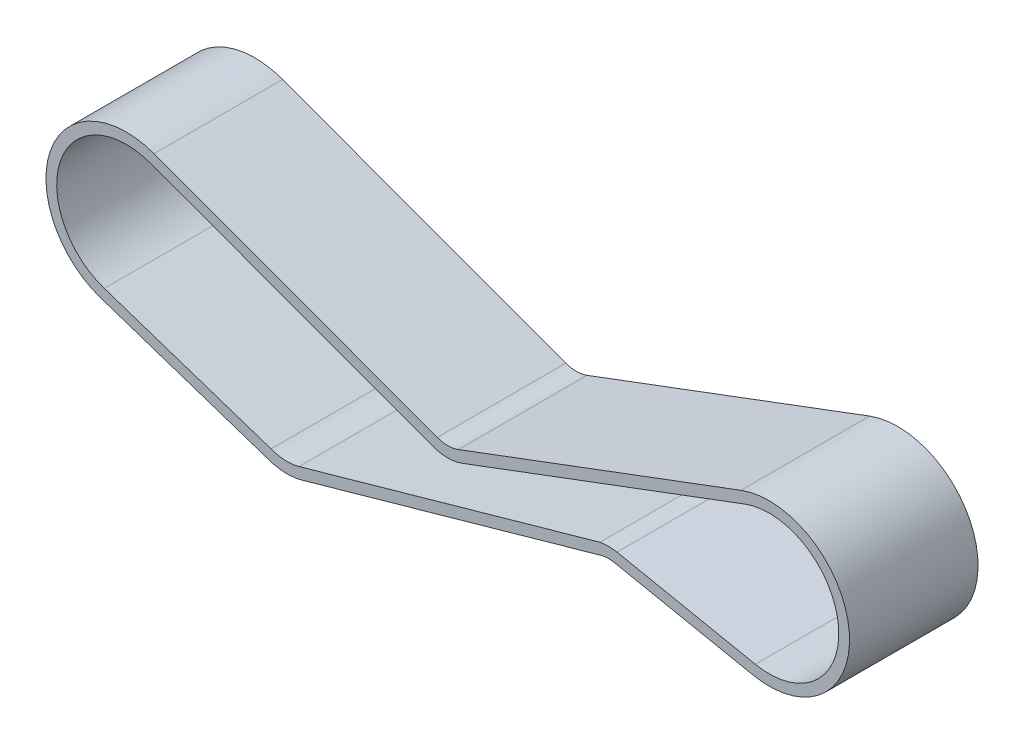
ISO-10303-21;
HEADER;
FILE_DESCRIPTION(('STEP AP214'),'2;1');
FILE_NAME('part.step','',(''),(''),'','','');
FILE_SCHEMA(('AUTOMOTIVE_DESIGN { 1 0 10303 214 1 1 1 1 }'));
ENDSEC;
DATA;
#1=APPLICATION_CONTEXT('core data for automotive mechanical design processes');
#2=APPLICATION_PROTOCOL_DEFINITION('international standard','automotive_design',2000,#1);
#3=PRODUCT_CONTEXT('',#1,'mechanical');
#4=PRODUCT('Part','Part','',(#3));
#5=PRODUCT_RELATED_PRODUCT_CATEGORY('part','',(#4));
#6=PRODUCT_DEFINITION_FORMATION('','',#4);
#7=PRODUCT_DEFINITION_CONTEXT('part definition',#1,'design');
#8=PRODUCT_DEFINITION('design','',#6,#7);
#9=PRODUCT_DEFINITION_SHAPE('','',#8);
#10=(LENGTH_UNIT() NAMED_UNIT(*) SI_UNIT(.MILLI.,.METRE.));
#11=(NAMED_UNIT(*) PLANE_ANGLE_UNIT() SI_UNIT($,.RADIAN.));
#12=(NAMED_UNIT(*) SI_UNIT($,.STERADIAN.) SOLID_ANGLE_UNIT());
#13=UNCERTAINTY_MEASURE_WITH_UNIT(LENGTH_MEASURE(1.E-05),#10,'distance_accuracy_value','');
#14=(GEOMETRIC_REPRESENTATION_CONTEXT(3) GLOBAL_UNCERTAINTY_ASSIGNED_CONTEXT((#13)) GLOBAL_UNIT_ASSIGNED_CONTEXT((#10,
#11,#12)) REPRESENTATION_CONTEXT('',''));
#15=CARTESIAN_POINT('',(0.,0.,0.));
#16=DIRECTION('',(0.,0.,1.));
#17=DIRECTION('',(1.,0.,0.));
#18=AXIS2_PLACEMENT_3D('',#15,#16,#17);
#19=CARTESIAN_POINT('',(29.4770286508606,0.19313179242635,12.));
#20=DIRECTION('',(0.,0.,1.));
#21=DIRECTION('',(1.,0.,0.));
#22=AXIS2_PLACEMENT_3D('',#19,#20,#21);
#23=PLANE('',#22);
#24=CARTESIAN_POINT('',(29.4770286508606,0.19313179242635,12.));
#25=DIRECTION('',(0.,0.,1.));
#26=DIRECTION('',(1.,0.,0.));
#27=AXIS2_PLACEMENT_3D('',#24,#25,#26);
#28=CIRCLE('',#27,7.50000000232554);
#29=CARTESIAN_POINT('',(27.9896361764472,-7.15789967682621,12.));
#30=VERTEX_POINT('',#29);
#31=CARTESIAN_POINT('',(26.8433552594607,7.21550777939224,12.));
#32=VERTEX_POINT('',#31);
#33=EDGE_CURVE('E250',#30,#32,#28,.T.);
#34=ORIENTED_EDGE('',*,*,#33,.T.);
#35=DIRECTION('',(-0.936316797971793,-0.351156452077773,0.));
#36=VECTOR('',#35,1.);
#37=CARTESIAN_POINT('',(0.477214368103966,-2.67285533707343,12.));
#38=LINE('',#37,#36);
#39=CARTESIAN_POINT('',(0.477214368103965,-2.67285533707343,12.));
#40=VERTEX_POINT('',#39);
#41=EDGE_CURVE('E253',#32,#40,#38,.T.);
#42=ORIENTED_EDGE('',*,*,#41,.T.);
#43=CARTESIAN_POINT('',(-0.522638014880138,-0.0068682075736624,12.));
#44=DIRECTION('',(0.,0.,-1.));
#45=DIRECTION('',(1.,0.,0.));
#46=AXIS2_PLACEMENT_3D('',#43,#44,#45);
#47=CIRCLE('',#46,2.84731314793743);
#48=CARTESIAN_POINT('',(-1.50470608838445,-2.67945767500425,12.));
#49=VERTEX_POINT('',#48);
#50=EDGE_CURVE('E256',#40,#49,#47,.T.);
#51=ORIENTED_EDGE('',*,*,#50,.T.);
#52=DIRECTION('',(-0.938635593828724,0.344910455042753,0.));
#53=VECTOR('',#52,1.);
#54=CARTESIAN_POINT('',(-27.9358094284505,7.03289921859945,12.));
#55=LINE('',#54,#53);
#56=CARTESIAN_POINT('',(-27.9358094284505,7.03289921859948,12.));
#57=VERTEX_POINT('',#56);
#58=EDGE_CURVE('E258',#49,#57,#55,.T.);
#59=ORIENTED_EDGE('',*,*,#58,.T.);
#60=CARTESIAN_POINT('',(-30.5226380148801,-0.006868207573652,12.));
#61=DIRECTION('',(0.,0.,1.));
#62=DIRECTION('',(1.,0.,0.));
#63=AXIS2_PLACEMENT_3D('',#60,#61,#62);
#64=CIRCLE('',#63,7.50000050334518);
#65=CARTESIAN_POINT('',(-32.8948896143065,-7.12181233238571,12.));
#66=VERTEX_POINT('',#65);
#67=EDGE_CURVE('E260',#57,#66,#64,.T.);
#68=ORIENTED_EDGE('',*,*,#67,.T.);
#69=DIRECTION('',(0.948659152974535,-0.316300192029089,0.));
#70=VECTOR('',#69,1.);
#71=CARTESIAN_POINT('',(-17.3500032724257,-12.3047597794117,12.));
#72=LINE('',#71,#70);
#73=CARTESIAN_POINT('',(-17.3500032724257,-12.3047597794117,12.));
#74=VERTEX_POINT('',#73);
#75=EDGE_CURVE('E262',#66,#74,#72,.T.);
#76=ORIENTED_EDGE('',*,*,#75,.T.);
#77=CARTESIAN_POINT('',(-15.5226380148801,-7.50686820757365,12.));
#78=DIRECTION('',(0.,0.,1.));
#79=DIRECTION('',(1.,0.,0.));
#80=AXIS2_PLACEMENT_3D('',#77,#78,#79);
#81=CIRCLE('',#80,5.13410433470139);
#82=CARTESIAN_POINT('',(-14.1288162505323,-12.4481522723517,12.));
#83=VERTEX_POINT('',#82);
#84=EDGE_CURVE('E264',#74,#83,#81,.T.);
#85=ORIENTED_EDGE('',*,*,#84,.T.);
#86=DIRECTION('',(0.962443250593871,0.271482944927122,0.));
#87=VECTOR('',#86,1.);
#88=CARTESIAN_POINT('',(13.9124107089229,-4.53837175321432,12.));
#89=LINE('',#88,#87);
#90=CARTESIAN_POINT('',(13.9124107089229,-4.53837175321428,12.));
#91=VERTEX_POINT('',#90);
#92=EDGE_CURVE('E266',#83,#91,#89,.T.);
#93=ORIENTED_EDGE('',*,*,#92,.T.);
#94=CARTESIAN_POINT('',(14.4773619851199,-7.50686820757365,12.));
#95=DIRECTION('',(0.,0.,-1.));
#96=DIRECTION('',(1.,0.,0.));
#97=AXIS2_PLACEMENT_3D('',#94,#95,#96);
#98=CIRCLE('',#97,3.02177781182216);
#99=CARTESIAN_POINT('',(15.0766379284879,-4.54511037011945,12.));
#100=VERTEX_POINT('',#99);
#101=EDGE_CURVE('E268',#91,#100,#98,.T.);
#102=ORIENTED_EDGE('',*,*,#101,.T.);
#103=DIRECTION('',(0.980137528929762,-0.198318996526959,0.));
#104=VECTOR('',#103,1.);
#105=CARTESIAN_POINT('',(15.0766379284879,-4.54511037011945,12.));
#106=LINE('',#105,#104);
#107=EDGE_CURVE('E270',#100,#30,#106,.T.);
#108=ORIENTED_EDGE('',*,*,#107,.T.);
#109=EDGE_LOOP('',(#34,#42,#51,#59,#68,#76,#85,#93,#102,#108));
#110=FACE_BOUND('',#109,.T.);
#111=DIRECTION('',(0.962443250593871,0.271482944927122,0.));
#112=VECTOR('',#111,1.);
#113=CARTESIAN_POINT('',(13.679767044611,-3.5649728413139,12.));
#114=LINE('',#113,#112);
#115=CARTESIAN_POINT('',(-14.4002991954594,-11.4857090217579,12.));
#116=VERTEX_POINT('',#115);
#117=CARTESIAN_POINT('',(13.679767044611,-3.5649728413139,12.));
#118=VERTEX_POINT('',#117);
#119=EDGE_CURVE('E179',#116,#118,#114,.T.);
#120=ORIENTED_EDGE('',*,*,#119,.F.);
#121=CARTESIAN_POINT('',(-15.5226380148801,-7.50686820757365,12.));
#122=DIRECTION('',(0.,0.,1.));
#123=DIRECTION('',(1.,0.,0.));
#124=AXIS2_PLACEMENT_3D('',#121,#122,#123);
#125=CIRCLE('',#124,4.13410433470138);
#126=CARTESIAN_POINT('',(-17.0126603577239,-11.3631166523737,12.));
#127=VERTEX_POINT('',#126);
#128=EDGE_CURVE('E171',#127,#116,#125,.T.);
#129=ORIENTED_EDGE('',*,*,#128,.F.);
#130=DIRECTION('',(0.948659152974534,-0.316300192029091,0.));
#131=VECTOR('',#130,1.);
#132=CARTESIAN_POINT('',(-17.0126603577239,-11.3631166523737,12.));
#133=LINE('',#132,#131);
#134=CARTESIAN_POINT('',(-32.578589422279,-6.17315317941062,12.));
#135=VERTEX_POINT('',#134);
#136=EDGE_CURVE('E208',#135,#127,#133,.T.);
#137=ORIENTED_EDGE('',*,*,#136,.F.);
#138=CARTESIAN_POINT('',(-30.5226380148817,-0.00686820757311238,12.));
#139=DIRECTION('',(0.,0.,1.));
#140=DIRECTION('',(1.,0.,0.));
#141=AXIS2_PLACEMENT_3D('',#138,#139,#140);
#142=CIRCLE('',#141,6.50000050334519);
#143=CARTESIAN_POINT('',(-28.2807198834948,6.09426362477131,12.));
#144=VERTEX_POINT('',#143);
#145=EDGE_CURVE('E206',#144,#135,#142,.T.);
#146=ORIENTED_EDGE('',*,*,#145,.F.);
#147=DIRECTION('',(-0.938635593828724,0.344910455042753,0.));
#148=VECTOR('',#147,1.);
#149=CARTESIAN_POINT('',(-28.2807198834948,6.0942636247713,12.));
#150=LINE('',#149,#148);
#151=CARTESIAN_POINT('',(-1.8496165434272,-3.61809326883297,12.));
#152=VERTEX_POINT('',#151);
#153=EDGE_CURVE('E204',#152,#144,#150,.T.);
#154=ORIENTED_EDGE('',*,*,#153,.F.);
#155=CARTESIAN_POINT('',(-0.522638014880138,-0.0068682075736624,12.));
#156=DIRECTION('',(0.,0.,-1.));
#157=DIRECTION('',(1.,0.,0.));
#158=AXIS2_PLACEMENT_3D('',#155,#156,#157);
#159=CIRCLE('',#158,3.84731314793743);
#160=CARTESIAN_POINT('',(0.828370820181734,-3.60917213504521,12.));
#161=VERTEX_POINT('',#160);
#162=EDGE_CURVE('E202',#161,#152,#159,.T.);
#163=ORIENTED_EDGE('',*,*,#162,.F.);
#164=DIRECTION('',(-0.936316797971793,-0.351156452077772,0.));
#165=VECTOR('',#164,1.);
#166=CARTESIAN_POINT('',(0.828370820181735,-3.60917213504521,12.));
#167=LINE('',#166,#165);
#168=CARTESIAN_POINT('',(27.1945117115384,6.27919098142043,12.));
#169=VERTEX_POINT('',#168);
#170=EDGE_CURVE('E200',#169,#161,#167,.T.);
#171=ORIENTED_EDGE('',*,*,#170,.F.);
#172=CARTESIAN_POINT('',(29.4770286508606,0.193131792426346,12.));
#173=DIRECTION('',(0.,0.,1.));
#174=DIRECTION('',(1.,0.,0.));
#175=AXIS2_PLACEMENT_3D('',#172,#173,#174);
#176=CIRCLE('',#175,6.50000000232553);
#177=CARTESIAN_POINT('',(28.1879551729742,-6.17776214789645,12.));
#178=VERTEX_POINT('',#177);
#179=EDGE_CURVE('E198',#178,#169,#176,.T.);
#180=ORIENTED_EDGE('',*,*,#179,.F.);
#181=DIRECTION('',(0.980137528929762,-0.198318996526959,0.));
#182=VECTOR('',#181,1.);
#183=CARTESIAN_POINT('',(15.2749569250148,-3.56497284118969,12.));
#184=LINE('',#183,#182);
#185=CARTESIAN_POINT('',(15.2749569250148,-3.56497284118969,12.));
#186=VERTEX_POINT('',#185);
#187=EDGE_CURVE('E194',#186,#178,#184,.T.);
#188=ORIENTED_EDGE('',*,*,#187,.F.);
#189=CARTESIAN_POINT('',(14.4773619851199,-7.50686820757365,12.));
#190=DIRECTION('',(0.,0.,-1.));
#191=DIRECTION('',(1.,0.,0.));
#192=AXIS2_PLACEMENT_3D('',#189,#190,#191);
#193=CIRCLE('',#192,4.0217778118222);
#194=EDGE_CURVE('E192',#118,#186,#193,.T.);
#195=ORIENTED_EDGE('',*,*,#194,.F.);
#196=EDGE_LOOP('',(#120,#129,#137,#146,#154,#163,#171,#180,#188,#195));
#197=FACE_BOUND('',#196,.T.);
#198=ADVANCED_FACE('F34',(#110,#197),#23,.T.);
#199=CARTESIAN_POINT('',(29.4770286508606,0.19313179242635,0.));
#200=DIRECTION('',(0.,0.,1.));
#201=DIRECTION('',(1.,0.,0.));
#202=AXIS2_PLACEMENT_3D('',#199,#200,#201);
#203=PLANE('',#202);
#204=CARTESIAN_POINT('',(29.4770286508606,0.19313179242635,0.));
#205=DIRECTION('',(0.,0.,1.));
#206=DIRECTION('',(1.,0.,0.));
#207=AXIS2_PLACEMENT_3D('',#204,#205,#206);
#208=CIRCLE('',#207,7.50000000232554);
#209=CARTESIAN_POINT('',(27.9896361764472,-7.15789967682621,0.));
#210=VERTEX_POINT('',#209);
#211=CARTESIAN_POINT('',(26.8433552594607,7.21550777939224,0.));
#212=VERTEX_POINT('',#211);
#213=EDGE_CURVE('E187',#210,#212,#208,.T.);
#214=ORIENTED_EDGE('',*,*,#213,.F.);
#215=DIRECTION('',(0.980137528929762,-0.198318996526959,0.));
#216=VECTOR('',#215,1.);
#217=CARTESIAN_POINT('',(15.0766379284879,-4.54511037011945,0.));
#218=LINE('',#217,#216);
#219=CARTESIAN_POINT('',(15.0766379284879,-4.54511037011945,0.));
#220=VERTEX_POINT('',#219);
#221=EDGE_CURVE('E254',#220,#210,#218,.T.);
#222=ORIENTED_EDGE('',*,*,#221,.F.);
#223=CARTESIAN_POINT('',(14.4773619851199,-7.50686820757365,0.));
#224=DIRECTION('',(0.,0.,-1.));
#225=DIRECTION('',(1.,0.,0.));
#226=AXIS2_PLACEMENT_3D('',#223,#224,#225);
#227=CIRCLE('',#226,3.02177781182216);
#228=CARTESIAN_POINT('',(13.9124107089229,-4.53837175321428,0.));
#229=VERTEX_POINT('',#228);
#230=EDGE_CURVE('E289',#229,#220,#227,.T.);
#231=ORIENTED_EDGE('',*,*,#230,.F.);
#232=DIRECTION('',(0.962443250593871,0.271482944927122,0.));
#233=VECTOR('',#232,1.);
#234=CARTESIAN_POINT('',(13.9124107089229,-4.53837175321432,0.));
#235=LINE('',#234,#233);
#236=CARTESIAN_POINT('',(-14.1288162505323,-12.4481522723517,0.));
#237=VERTEX_POINT('',#236);
#238=EDGE_CURVE('E287',#237,#229,#235,.T.);
#239=ORIENTED_EDGE('',*,*,#238,.F.);
#240=CARTESIAN_POINT('',(-15.5226380148801,-7.50686820757365,0.));
#241=DIRECTION('',(0.,0.,1.));
#242=DIRECTION('',(1.,0.,0.));
#243=AXIS2_PLACEMENT_3D('',#240,#241,#242);
#244=CIRCLE('',#243,5.13410433470139);
#245=CARTESIAN_POINT('',(-17.3500032724257,-12.3047597794117,0.));
#246=VERTEX_POINT('',#245);
#247=EDGE_CURVE('E285',#246,#237,#244,.T.);
#248=ORIENTED_EDGE('',*,*,#247,.F.);
#249=DIRECTION('',(0.948659152974535,-0.316300192029089,0.));
#250=VECTOR('',#249,1.);
#251=CARTESIAN_POINT('',(-17.3500032724257,-12.3047597794117,0.));
#252=LINE('',#251,#250);
#253=CARTESIAN_POINT('',(-32.8948896143065,-7.12181233238571,0.));
#254=VERTEX_POINT('',#253);
#255=EDGE_CURVE('E283',#254,#246,#252,.T.);
#256=ORIENTED_EDGE('',*,*,#255,.F.);
#257=CARTESIAN_POINT('',(-30.5226380148801,-0.006868207573652,0.));
#258=DIRECTION('',(0.,0.,1.));
#259=DIRECTION('',(1.,0.,0.));
#260=AXIS2_PLACEMENT_3D('',#257,#258,#259);
#261=CIRCLE('',#260,7.50000050334518);
#262=CARTESIAN_POINT('',(-27.9358094284505,7.03289921859948,0.));
#263=VERTEX_POINT('',#262);
#264=EDGE_CURVE('E281',#263,#254,#261,.T.);
#265=ORIENTED_EDGE('',*,*,#264,.F.);
#266=DIRECTION('',(-0.938635593828724,0.344910455042753,0.));
#267=VECTOR('',#266,1.);
#268=CARTESIAN_POINT('',(-27.9358094284505,7.03289921859945,0.));
#269=LINE('',#268,#267);
#270=CARTESIAN_POINT('',(-1.50470608838445,-2.67945767500425,0.));
#271=VERTEX_POINT('',#270);
#272=EDGE_CURVE('E279',#271,#263,#269,.T.);
#273=ORIENTED_EDGE('',*,*,#272,.F.);
#274=CARTESIAN_POINT('',(-0.522638014880138,-0.0068682075736624,0.));
#275=DIRECTION('',(0.,0.,-1.));
#276=DIRECTION('',(1.,0.,0.));
#277=AXIS2_PLACEMENT_3D('',#274,#275,#276);
#278=CIRCLE('',#277,2.84731314793743);
#279=CARTESIAN_POINT('',(0.477214368103965,-2.67285533707343,0.));
#280=VERTEX_POINT('',#279);
#281=EDGE_CURVE('E277',#280,#271,#278,.T.);
#282=ORIENTED_EDGE('',*,*,#281,.F.);
#283=DIRECTION('',(-0.936316797971793,-0.351156452077773,0.));
#284=VECTOR('',#283,1.);
#285=CARTESIAN_POINT('',(0.477214368103966,-2.67285533707343,0.));
#286=LINE('',#285,#284);
#287=EDGE_CURVE('E275',#212,#280,#286,.T.);
#288=ORIENTED_EDGE('',*,*,#287,.F.);
#289=EDGE_LOOP('',(#214,#222,#231,#239,#248,#256,#265,#273,#282,#288));
#290=FACE_BOUND('',#289,.T.);
#291=CARTESIAN_POINT('',(-15.5226380148801,-7.50686820757365,0.));
#292=DIRECTION('',(0.,0.,1.));
#293=DIRECTION('',(1.,0.,0.));
#294=AXIS2_PLACEMENT_3D('',#291,#292,#293);
#295=CIRCLE('',#294,4.13410433470138);
#296=CARTESIAN_POINT('',(-17.0126603577239,-11.3631166523738,0.));
#297=VERTEX_POINT('',#296);
#298=CARTESIAN_POINT('',(-14.4002991954594,-11.4857090217579,0.));
#299=VERTEX_POINT('',#298);
#300=EDGE_CURVE('E57',#297,#299,#295,.T.);
#301=ORIENTED_EDGE('',*,*,#300,.T.);
#302=DIRECTION('',(0.962443250593871,0.271482944927122,0.));
#303=VECTOR('',#302,1.);
#304=CARTESIAN_POINT('',(13.679767044611,-3.5649728413139,0.));
#305=LINE('',#304,#303);
#306=CARTESIAN_POINT('',(13.679767044611,-3.5649728413139,0.));
#307=VERTEX_POINT('',#306);
#308=EDGE_CURVE('E186',#299,#307,#305,.T.);
#309=ORIENTED_EDGE('',*,*,#308,.T.);
#310=CARTESIAN_POINT('',(14.4773619851199,-7.50686820757365,0.));
#311=DIRECTION('',(0.,0.,-1.));
#312=DIRECTION('',(1.,0.,0.));
#313=AXIS2_PLACEMENT_3D('',#310,#311,#312);
#314=CIRCLE('',#313,4.0217778118222);
#315=CARTESIAN_POINT('',(15.2749569250148,-3.56497284118969,0.));
#316=VERTEX_POINT('',#315);
#317=EDGE_CURVE('E212',#307,#316,#314,.T.);
#318=ORIENTED_EDGE('',*,*,#317,.T.);
#319=DIRECTION('',(0.980137528929762,-0.198318996526959,0.));
#320=VECTOR('',#319,1.);
#321=CARTESIAN_POINT('',(15.2749569250148,-3.56497284118969,0.));
#322=LINE('',#321,#320);
#323=CARTESIAN_POINT('',(28.1879551729742,-6.17776214789645,0.));
#324=VERTEX_POINT('',#323);
#325=EDGE_CURVE('E215',#316,#324,#322,.T.);
#326=ORIENTED_EDGE('',*,*,#325,.T.);
#327=CARTESIAN_POINT('',(29.4770286508606,0.193131792426346,0.));
#328=DIRECTION('',(0.,0.,1.));
#329=DIRECTION('',(1.,0.,0.));
#330=AXIS2_PLACEMENT_3D('',#327,#328,#329);
#331=CIRCLE('',#330,6.50000000232553);
#332=CARTESIAN_POINT('',(27.1945117115384,6.27919098142043,0.));
#333=VERTEX_POINT('',#332);
#334=EDGE_CURVE('E218',#324,#333,#331,.T.);
#335=ORIENTED_EDGE('',*,*,#334,.T.);
#336=DIRECTION('',(-0.936316797971793,-0.351156452077772,0.));
#337=VECTOR('',#336,1.);
#338=CARTESIAN_POINT('',(0.828370820181735,-3.60917213504521,0.));
#339=LINE('',#338,#337);
#340=CARTESIAN_POINT('',(0.828370820181734,-3.60917213504521,0.));
#341=VERTEX_POINT('',#340);
#342=EDGE_CURVE('E221',#333,#341,#339,.T.);
#343=ORIENTED_EDGE('',*,*,#342,.T.);
#344=CARTESIAN_POINT('',(-0.522638014880138,-0.0068682075736624,0.));
#345=DIRECTION('',(0.,0.,-1.));
#346=DIRECTION('',(1.,0.,0.));
#347=AXIS2_PLACEMENT_3D('',#344,#345,#346);
#348=CIRCLE('',#347,3.84731314793743);
#349=CARTESIAN_POINT('',(-1.8496165434272,-3.61809326883297,0.));
#350=VERTEX_POINT('',#349);
#351=EDGE_CURVE('E224',#341,#350,#348,.T.);
#352=ORIENTED_EDGE('',*,*,#351,.T.);
#353=DIRECTION('',(-0.938635593828724,0.344910455042753,0.));
#354=VECTOR('',#353,1.);
#355=CARTESIAN_POINT('',(-28.2807198834948,6.0942636247713,0.));
#356=LINE('',#355,#354);
#357=CARTESIAN_POINT('',(-28.2807198834948,6.09426362477131,0.));
#358=VERTEX_POINT('',#357);
#359=EDGE_CURVE('E227',#350,#358,#356,.T.);
#360=ORIENTED_EDGE('',*,*,#359,.T.);
#361=CARTESIAN_POINT('',(-30.5226380148817,-0.00686820757311238,0.));
#362=DIRECTION('',(0.,0.,1.));
#363=DIRECTION('',(1.,0.,0.));
#364=AXIS2_PLACEMENT_3D('',#361,#362,#363);
#365=CIRCLE('',#364,6.50000050334519);
#366=CARTESIAN_POINT('',(-32.578589422279,-6.17315317941061,0.));
#367=VERTEX_POINT('',#366);
#368=EDGE_CURVE('E230',#358,#367,#365,.T.);
#369=ORIENTED_EDGE('',*,*,#368,.T.);
#370=DIRECTION('',(0.948659152974534,-0.316300192029091,0.));
#371=VECTOR('',#370,1.);
#372=CARTESIAN_POINT('',(-17.0126603577239,-11.3631166523737,0.));
#373=LINE('',#372,#371);
#374=EDGE_CURVE('E180',#367,#297,#373,.T.);
#375=ORIENTED_EDGE('',*,*,#374,.T.);
#376=EDGE_LOOP('',(#301,#309,#318,#326,#335,#343,#352,#360,#369,#375));
#377=FACE_BOUND('',#376,.T.);
#378=ADVANCED_FACE('F325',(#290,#377),#203,.F.);
#379=CARTESIAN_POINT('',(29.4770286508606,0.19313179242635,12.));
#380=DIRECTION('',(0.,0.,-1.));
#381=DIRECTION('',(-1.,0.,0.));
#382=AXIS2_PLACEMENT_3D('',#379,#380,#381);
#383=CYLINDRICAL_SURFACE('',#382,7.50000000232554);
#384=ORIENTED_EDGE('',*,*,#213,.T.);
#385=DIRECTION('',(0.,0.,-1.));
#386=VECTOR('',#385,1.);
#387=CARTESIAN_POINT('',(26.8433552594607,7.21550777939224,12.));
#388=LINE('',#387,#386);
#389=EDGE_CURVE('E11',#32,#212,#388,.T.);
#390=ORIENTED_EDGE('',*,*,#389,.F.);
#391=ORIENTED_EDGE('',*,*,#33,.F.);
#392=DIRECTION('',(0.,0.,-1.));
#393=VECTOR('',#392,1.);
#394=CARTESIAN_POINT('',(27.9896361764472,-7.15789967682621,12.));
#395=LINE('',#394,#393);
#396=EDGE_CURVE('E272',#30,#210,#395,.T.);
#397=ORIENTED_EDGE('',*,*,#396,.T.);
#398=EDGE_LOOP('',(#384,#390,#391,#397));
#399=FACE_BOUND('',#398,.T.);
#400=ADVANCED_FACE('F36',(#399),#383,.T.);
#401=CARTESIAN_POINT('',(0.477214368103966,-2.67285533707343,12.));
#402=DIRECTION('',(0.351156452077773,-0.936316797971793,0.));
#403=DIRECTION('',(0.936316797971793,0.351156452077773,0.));
#404=AXIS2_PLACEMENT_3D('',#401,#402,#403);
#405=PLANE('',#404);
#406=ORIENTED_EDGE('',*,*,#287,.T.);
#407=DIRECTION('',(0.,0.,-1.));
#408=VECTOR('',#407,1.);
#409=CARTESIAN_POINT('',(0.477214368103965,-2.67285533707343,12.));
#410=LINE('',#409,#408);
#411=EDGE_CURVE('E42',#40,#280,#410,.T.);
#412=ORIENTED_EDGE('',*,*,#411,.F.);
#413=ORIENTED_EDGE('',*,*,#41,.F.);
#414=ORIENTED_EDGE('',*,*,#389,.T.);
#415=EDGE_LOOP('',(#406,#412,#413,#414));
#416=FACE_BOUND('',#415,.T.);
#417=ADVANCED_FACE('F342',(#416),#405,.F.);
#418=CARTESIAN_POINT('',(-0.522638014880138,-0.0068682075736624,12.));
#419=DIRECTION('',(0.,0.,-1.));
#420=DIRECTION('',(-1.,0.,0.));
#421=AXIS2_PLACEMENT_3D('',#418,#419,#420);
#422=CYLINDRICAL_SURFACE('',#421,2.84731314793743);
#423=ORIENTED_EDGE('',*,*,#281,.T.);
#424=DIRECTION('',(0.,0.,-1.));
#425=VECTOR('',#424,1.);
#426=CARTESIAN_POINT('',(-1.50470608838445,-2.67945767500425,12.));
#427=LINE('',#426,#425);
#428=EDGE_CURVE('E312',#49,#271,#427,.T.);
#429=ORIENTED_EDGE('',*,*,#428,.F.);
#430=ORIENTED_EDGE('',*,*,#50,.F.);
#431=ORIENTED_EDGE('',*,*,#411,.T.);
#432=EDGE_LOOP('',(#423,#429,#430,#431));
#433=FACE_BOUND('',#432,.T.);
#434=ADVANCED_FACE('F319',(#433),#422,.F.);
#435=CARTESIAN_POINT('',(-27.9358094284505,7.03289921859945,12.));
#436=DIRECTION('',(-0.344910455042753,-0.938635593828724,0.));
#437=DIRECTION('',(0.938635593828724,-0.344910455042753,0.));
#438=AXIS2_PLACEMENT_3D('',#435,#436,#437);
#439=PLANE('',#438);
#440=ORIENTED_EDGE('',*,*,#272,.T.);
#441=DIRECTION('',(0.,0.,-1.));
#442=VECTOR('',#441,1.);
#443=CARTESIAN_POINT('',(-27.9358094284505,7.03289921859948,12.));
#444=LINE('',#443,#442);
#445=EDGE_CURVE('E309',#57,#263,#444,.T.);
#446=ORIENTED_EDGE('',*,*,#445,.F.);
#447=ORIENTED_EDGE('',*,*,#58,.F.);
#448=ORIENTED_EDGE('',*,*,#428,.T.);
#449=EDGE_LOOP('',(#440,#446,#447,#448));
#450=FACE_BOUND('',#449,.T.);
#451=ADVANCED_FACE('F331',(#450),#439,.F.);
#452=CARTESIAN_POINT('',(-30.5226380148801,-0.006868207573652,12.));
#453=DIRECTION('',(0.,0.,-1.));
#454=DIRECTION('',(-1.,0.,0.));
#455=AXIS2_PLACEMENT_3D('',#452,#453,#454);
#456=CYLINDRICAL_SURFACE('',#455,7.50000050334518);
#457=ORIENTED_EDGE('',*,*,#264,.T.);
#458=DIRECTION('',(0.,0.,-1.));
#459=VECTOR('',#458,1.);
#460=CARTESIAN_POINT('',(-32.8948896143065,-7.12181233238571,12.));
#461=LINE('',#460,#459);
#462=EDGE_CURVE('E306',#66,#254,#461,.T.);
#463=ORIENTED_EDGE('',*,*,#462,.F.);
#464=ORIENTED_EDGE('',*,*,#67,.F.);
#465=ORIENTED_EDGE('',*,*,#445,.T.);
#466=EDGE_LOOP('',(#457,#463,#464,#465));
#467=FACE_BOUND('',#466,.T.);
#468=ADVANCED_FACE('F335',(#467),#456,.T.);
#469=CARTESIAN_POINT('',(-17.3500032724257,-12.3047597794117,12.));
#470=DIRECTION('',(0.316300192029089,0.948659152974535,0.));
#471=DIRECTION('',(-0.948659152974535,0.316300192029089,0.));
#472=AXIS2_PLACEMENT_3D('',#469,#470,#471);
#473=PLANE('',#472);
#474=ORIENTED_EDGE('',*,*,#255,.T.);
#475=DIRECTION('',(0.,0.,-1.));
#476=VECTOR('',#475,1.);
#477=CARTESIAN_POINT('',(-17.3500032724257,-12.3047597794117,12.));
#478=LINE('',#477,#476);
#479=EDGE_CURVE('E303',#74,#246,#478,.T.);
#480=ORIENTED_EDGE('',*,*,#479,.F.);
#481=ORIENTED_EDGE('',*,*,#75,.F.);
#482=ORIENTED_EDGE('',*,*,#462,.T.);
#483=EDGE_LOOP('',(#474,#480,#481,#482));
#484=FACE_BOUND('',#483,.T.);
#485=ADVANCED_FACE('F365',(#484),#473,.F.);
#486=CARTESIAN_POINT('',(-15.5226380148801,-7.50686820757365,12.));
#487=DIRECTION('',(0.,0.,-1.));
#488=DIRECTION('',(-1.,0.,0.));
#489=AXIS2_PLACEMENT_3D('',#486,#487,#488);
#490=CYLINDRICAL_SURFACE('',#489,5.13410433470139);
#491=ORIENTED_EDGE('',*,*,#247,.T.);
#492=DIRECTION('',(0.,0.,-1.));
#493=VECTOR('',#492,1.);
#494=CARTESIAN_POINT('',(-14.1288162505323,-12.4481522723517,12.));
#495=LINE('',#494,#493);
#496=EDGE_CURVE('E300',#83,#237,#495,.T.);
#497=ORIENTED_EDGE('',*,*,#496,.F.);
#498=ORIENTED_EDGE('',*,*,#84,.F.);
#499=ORIENTED_EDGE('',*,*,#479,.T.);
#500=EDGE_LOOP('',(#491,#497,#498,#499));
#501=FACE_BOUND('',#500,.T.);
#502=ADVANCED_FACE('F362',(#501),#490,.T.);
#503=CARTESIAN_POINT('',(13.9124107089229,-4.53837175321432,12.));
#504=DIRECTION('',(-0.271482944927122,0.962443250593871,0.));
#505=DIRECTION('',(-0.962443250593871,-0.271482944927122,0.));
#506=AXIS2_PLACEMENT_3D('',#503,#504,#505);
#507=PLANE('',#506);
#508=ORIENTED_EDGE('',*,*,#238,.T.);
#509=DIRECTION('',(0.,0.,-1.));
#510=VECTOR('',#509,1.);
#511=CARTESIAN_POINT('',(13.9124107089229,-4.53837175321428,12.));
#512=LINE('',#511,#510);
#513=EDGE_CURVE('E297',#91,#229,#512,.T.);
#514=ORIENTED_EDGE('',*,*,#513,.F.);
#515=ORIENTED_EDGE('',*,*,#92,.F.);
#516=ORIENTED_EDGE('',*,*,#496,.T.);
#517=EDGE_LOOP('',(#508,#514,#515,#516));
#518=FACE_BOUND('',#517,.T.);
#519=ADVANCED_FACE('F358',(#518),#507,.F.);
#520=CARTESIAN_POINT('',(14.4773619851199,-7.50686820757365,12.));
#521=DIRECTION('',(0.,0.,-1.));
#522=DIRECTION('',(-1.,0.,0.));
#523=AXIS2_PLACEMENT_3D('',#520,#521,#522);
#524=CYLINDRICAL_SURFACE('',#523,3.02177781182216);
#525=ORIENTED_EDGE('',*,*,#230,.T.);
#526=DIRECTION('',(0.,0.,-1.));
#527=VECTOR('',#526,1.);
#528=CARTESIAN_POINT('',(15.0766379284879,-4.54511037011945,12.));
#529=LINE('',#528,#527);
#530=EDGE_CURVE('E294',#100,#220,#529,.T.);
#531=ORIENTED_EDGE('',*,*,#530,.F.);
#532=ORIENTED_EDGE('',*,*,#101,.F.);
#533=ORIENTED_EDGE('',*,*,#513,.T.);
#534=EDGE_LOOP('',(#525,#531,#532,#533));
#535=FACE_BOUND('',#534,.T.);
#536=ADVANCED_FACE('F354',(#535),#524,.F.);
#537=CARTESIAN_POINT('',(15.0766379284879,-4.54511037011945,12.));
#538=DIRECTION('',(0.198318996526959,0.980137528929762,0.));
#539=DIRECTION('',(-0.980137528929762,0.198318996526959,0.));
#540=AXIS2_PLACEMENT_3D('',#537,#538,#539);
#541=PLANE('',#540);
#542=ORIENTED_EDGE('',*,*,#221,.T.);
#543=ORIENTED_EDGE('',*,*,#396,.F.);
#544=ORIENTED_EDGE('',*,*,#107,.F.);
#545=ORIENTED_EDGE('',*,*,#530,.T.);
#546=EDGE_LOOP('',(#542,#543,#544,#545));
#547=FACE_BOUND('',#546,.T.);
#548=ADVANCED_FACE('F349',(#547),#541,.F.);
#549=CARTESIAN_POINT('',(-15.5226380148801,-7.50686820757365,12.));
#550=DIRECTION('',(0.,0.,-1.));
#551=DIRECTION('',(-1.,0.,0.));
#552=AXIS2_PLACEMENT_3D('',#549,#550,#551);
#553=CYLINDRICAL_SURFACE('',#552,4.13410433470138);
#554=ORIENTED_EDGE('',*,*,#300,.F.);
#555=DIRECTION('',(0.,0.,-1.));
#556=VECTOR('',#555,1.);
#557=CARTESIAN_POINT('',(-17.0126603577239,-11.3631166523737,12.));
#558=LINE('',#557,#556);
#559=EDGE_CURVE('E175',#127,#297,#558,.T.);
#560=ORIENTED_EDGE('',*,*,#559,.F.);
#561=ORIENTED_EDGE('',*,*,#128,.T.);
#562=DIRECTION('',(0.,0.,-1.));
#563=VECTOR('',#562,1.);
#564=CARTESIAN_POINT('',(-14.4002991954594,-11.4857090217579,12.));
#565=LINE('',#564,#563);
#566=EDGE_CURVE('E174',#116,#299,#565,.T.);
#567=ORIENTED_EDGE('',*,*,#566,.T.);
#568=EDGE_LOOP('',(#554,#560,#561,#567));
#569=FACE_BOUND('',#568,.T.);
#570=ADVANCED_FACE('F173',(#569),#553,.F.);
#571=CARTESIAN_POINT('',(13.679767044611,-3.5649728413139,12.));
#572=DIRECTION('',(-0.271482944927122,0.962443250593871,0.));
#573=DIRECTION('',(-0.962443250593871,-0.271482944927122,0.));
#574=AXIS2_PLACEMENT_3D('',#571,#572,#573);
#575=PLANE('',#574);
#576=ORIENTED_EDGE('',*,*,#308,.F.);
#577=ORIENTED_EDGE('',*,*,#566,.F.);
#578=ORIENTED_EDGE('',*,*,#119,.T.);
#579=DIRECTION('',(0.,0.,-1.));
#580=VECTOR('',#579,1.);
#581=CARTESIAN_POINT('',(13.679767044611,-3.5649728413139,12.));
#582=LINE('',#581,#580);
#583=EDGE_CURVE('E188',#118,#307,#582,.T.);
#584=ORIENTED_EDGE('',*,*,#583,.T.);
#585=EDGE_LOOP('',(#576,#577,#578,#584));
#586=FACE_BOUND('',#585,.T.);
#587=ADVANCED_FACE('F183',(#586),#575,.T.);
#588=CARTESIAN_POINT('',(14.4773619851199,-7.50686820757365,12.));
#589=DIRECTION('',(0.,0.,-1.));
#590=DIRECTION('',(-1.,0.,0.));
#591=AXIS2_PLACEMENT_3D('',#588,#589,#590);
#592=CYLINDRICAL_SURFACE('',#591,4.0217778118222);
#593=ORIENTED_EDGE('',*,*,#317,.F.);
#594=ORIENTED_EDGE('',*,*,#583,.F.);
#595=ORIENTED_EDGE('',*,*,#194,.T.);
#596=DIRECTION('',(0.,0.,-1.));
#597=VECTOR('',#596,1.);
#598=CARTESIAN_POINT('',(15.2749569250148,-3.56497284118969,12.));
#599=LINE('',#598,#597);
#600=EDGE_CURVE('E247',#186,#316,#599,.T.);
#601=ORIENTED_EDGE('',*,*,#600,.T.);
#602=EDGE_LOOP('',(#593,#594,#595,#601));
#603=FACE_BOUND('',#602,.T.);
#604=ADVANCED_FACE('F411',(#603),#592,.T.);
#605=CARTESIAN_POINT('',(15.2749569250148,-3.56497284118969,12.));
#606=DIRECTION('',(0.198318996526959,0.980137528929762,0.));
#607=DIRECTION('',(-0.980137528929762,0.198318996526959,0.));
#608=AXIS2_PLACEMENT_3D('',#605,#606,#607);
#609=PLANE('',#608);
#610=ORIENTED_EDGE('',*,*,#325,.F.);
#611=ORIENTED_EDGE('',*,*,#600,.F.);
#612=ORIENTED_EDGE('',*,*,#187,.T.);
#613=DIRECTION('',(0.,0.,-1.));
#614=VECTOR('',#613,1.);
#615=CARTESIAN_POINT('',(28.1879551729742,-6.17776214789645,12.));
#616=LINE('',#615,#614);
#617=EDGE_CURVE('E245',#178,#324,#616,.T.);
#618=ORIENTED_EDGE('',*,*,#617,.T.);
#619=EDGE_LOOP('',(#610,#611,#612,#618));
#620=FACE_BOUND('',#619,.T.);
#621=ADVANCED_FACE('F417',(#620),#609,.T.);
#622=CARTESIAN_POINT('',(29.4770286508606,0.193131792426346,12.));
#623=DIRECTION('',(0.,0.,-1.));
#624=DIRECTION('',(-1.,0.,0.));
#625=AXIS2_PLACEMENT_3D('',#622,#623,#624);
#626=CYLINDRICAL_SURFACE('',#625,6.50000000232553);
#627=ORIENTED_EDGE('',*,*,#334,.F.);
#628=ORIENTED_EDGE('',*,*,#617,.F.);
#629=ORIENTED_EDGE('',*,*,#179,.T.);
#630=DIRECTION('',(0.,0.,-1.));
#631=VECTOR('',#630,1.);
#632=CARTESIAN_POINT('',(27.1945117115384,6.27919098142043,12.));
#633=LINE('',#632,#631);
#634=EDGE_CURVE('E243',#169,#333,#633,.T.);
#635=ORIENTED_EDGE('',*,*,#634,.T.);
#636=EDGE_LOOP('',(#627,#628,#629,#635));
#637=FACE_BOUND('',#636,.T.);
#638=ADVANCED_FACE('F425',(#637),#626,.F.);
#639=CARTESIAN_POINT('',(0.828370820181735,-3.60917213504521,12.));
#640=DIRECTION('',(0.351156452077772,-0.936316797971793,0.));
#641=DIRECTION('',(0.936316797971793,0.351156452077772,0.));
#642=AXIS2_PLACEMENT_3D('',#639,#640,#641);
#643=PLANE('',#642);
#644=ORIENTED_EDGE('',*,*,#342,.F.);
#645=ORIENTED_EDGE('',*,*,#634,.F.);
#646=ORIENTED_EDGE('',*,*,#170,.T.);
#647=DIRECTION('',(0.,0.,-1.));
#648=VECTOR('',#647,1.);
#649=CARTESIAN_POINT('',(0.828370820181734,-3.60917213504521,12.));
#650=LINE('',#649,#648);
#651=EDGE_CURVE('E241',#161,#341,#650,.T.);
#652=ORIENTED_EDGE('',*,*,#651,.T.);
#653=EDGE_LOOP('',(#644,#645,#646,#652));
#654=FACE_BOUND('',#653,.T.);
#655=ADVANCED_FACE('F433',(#654),#643,.T.);
#656=CARTESIAN_POINT('',(-0.522638014880138,-0.0068682075736624,12.));
#657=DIRECTION('',(0.,0.,-1.));
#658=DIRECTION('',(-1.,0.,0.));
#659=AXIS2_PLACEMENT_3D('',#656,#657,#658);
#660=CYLINDRICAL_SURFACE('',#659,3.84731314793743);
#661=ORIENTED_EDGE('',*,*,#351,.F.);
#662=ORIENTED_EDGE('',*,*,#651,.F.);
#663=ORIENTED_EDGE('',*,*,#162,.T.);
#664=DIRECTION('',(0.,0.,-1.));
#665=VECTOR('',#664,1.);
#666=CARTESIAN_POINT('',(-1.8496165434272,-3.61809326883297,12.));
#667=LINE('',#666,#665);
#668=EDGE_CURVE('E239',#152,#350,#667,.T.);
#669=ORIENTED_EDGE('',*,*,#668,.T.);
#670=EDGE_LOOP('',(#661,#662,#663,#669));
#671=FACE_BOUND('',#670,.T.);
#672=ADVANCED_FACE('F441',(#671),#660,.T.);
#673=CARTESIAN_POINT('',(-28.2807198834948,6.0942636247713,12.));
#674=DIRECTION('',(-0.344910455042753,-0.938635593828724,0.));
#675=DIRECTION('',(0.938635593828724,-0.344910455042753,0.));
#676=AXIS2_PLACEMENT_3D('',#673,#674,#675);
#677=PLANE('',#676);
#678=ORIENTED_EDGE('',*,*,#359,.F.);
#679=ORIENTED_EDGE('',*,*,#668,.F.);
#680=ORIENTED_EDGE('',*,*,#153,.T.);
#681=DIRECTION('',(0.,0.,-1.));
#682=VECTOR('',#681,1.);
#683=CARTESIAN_POINT('',(-28.2807198834948,6.09426362477131,12.));
#684=LINE('',#683,#682);
#685=EDGE_CURVE('E237',#144,#358,#684,.T.);
#686=ORIENTED_EDGE('',*,*,#685,.T.);
#687=EDGE_LOOP('',(#678,#679,#680,#686));
#688=FACE_BOUND('',#687,.T.);
#689=ADVANCED_FACE('F449',(#688),#677,.T.);
#690=CARTESIAN_POINT('',(-30.5226380148817,-0.00686820757311238,12.));
#691=DIRECTION('',(0.,0.,-1.));
#692=DIRECTION('',(-1.,0.,0.));
#693=AXIS2_PLACEMENT_3D('',#690,#691,#692);
#694=CYLINDRICAL_SURFACE('',#693,6.50000050334519);
#695=ORIENTED_EDGE('',*,*,#368,.F.);
#696=ORIENTED_EDGE('',*,*,#685,.F.);
#697=ORIENTED_EDGE('',*,*,#145,.T.);
#698=DIRECTION('',(0.,0.,-1.));
#699=VECTOR('',#698,1.);
#700=CARTESIAN_POINT('',(-32.578589422279,-6.17315317941061,12.));
#701=LINE('',#700,#699);
#702=EDGE_CURVE('E49',#135,#367,#701,.T.);
#703=ORIENTED_EDGE('',*,*,#702,.T.);
#704=EDGE_LOOP('',(#695,#696,#697,#703));
#705=FACE_BOUND('',#704,.T.);
#706=ADVANCED_FACE('F457',(#705),#694,.F.);
#707=CARTESIAN_POINT('',(-17.0126603577239,-11.3631166523737,12.));
#708=DIRECTION('',(0.316300192029091,0.948659152974534,0.));
#709=DIRECTION('',(-0.948659152974534,0.316300192029091,0.));
#710=AXIS2_PLACEMENT_3D('',#707,#708,#709);
#711=PLANE('',#710);
#712=ORIENTED_EDGE('',*,*,#374,.F.);
#713=ORIENTED_EDGE('',*,*,#702,.F.);
#714=ORIENTED_EDGE('',*,*,#136,.T.);
#715=ORIENTED_EDGE('',*,*,#559,.T.);
#716=EDGE_LOOP('',(#712,#713,#714,#715));
#717=FACE_BOUND('',#716,.T.);
#718=ADVANCED_FACE('F465',(#717),#711,.T.);
#719=CLOSED_SHELL('',(#198,#378,#400,#417,#434,#451,#468,#485,#502,#519,#536,#548,#570,#587,
#604,#621,#638,#655,#672,#689,#706,#718));
#720=MANIFOLD_SOLID_BREP('B2',#719);
#721=ADVANCED_BREP_SHAPE_REPRESENTATION('',(#18,#720),#14);
#722=SHAPE_DEFINITION_REPRESENTATION(#9,#721);
ENDSEC;
END-ISO-10303-21;
